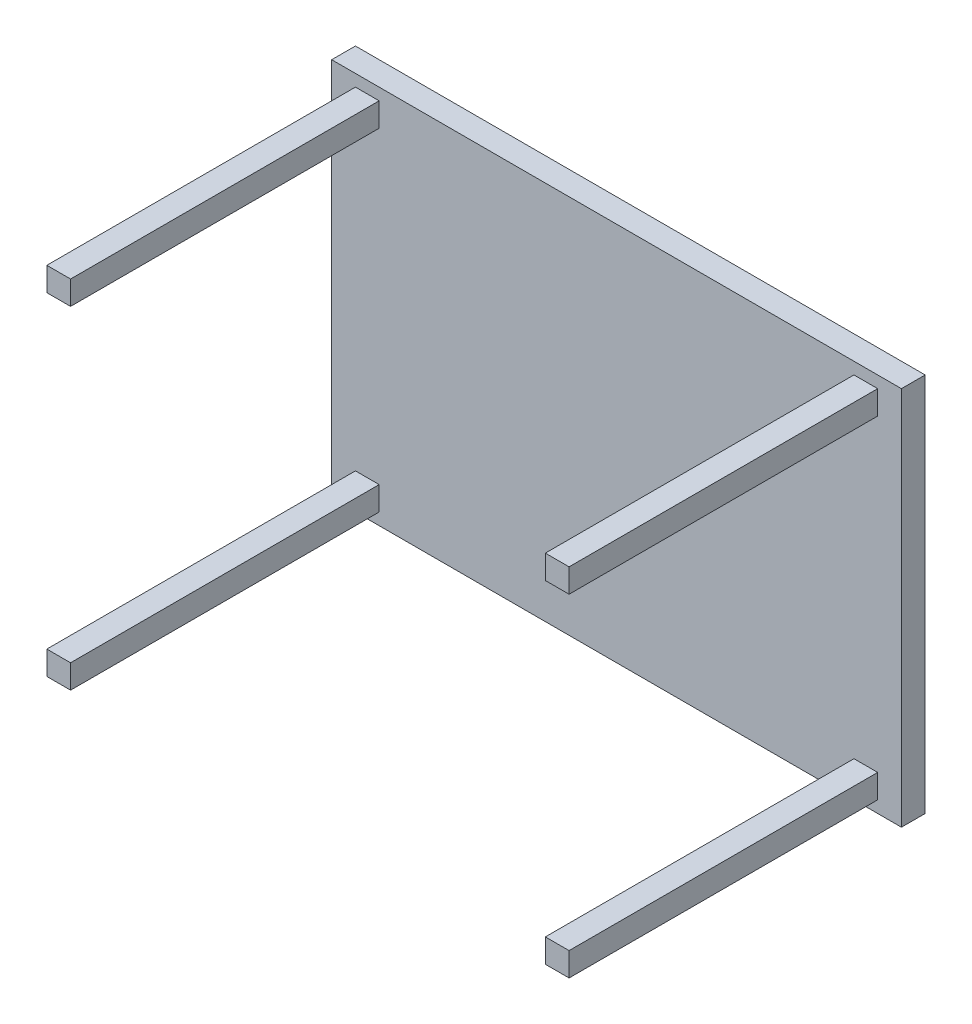
ISO-10303-21;
HEADER;
FILE_DESCRIPTION(('STEP AP214'),'2;1');
FILE_NAME('part.step','',(''),(''),'','','');
FILE_SCHEMA(('AUTOMOTIVE_DESIGN { 1 0 10303 214 1 1 1 1 }'));
ENDSEC;
DATA;
#1=APPLICATION_CONTEXT('core data for automotive mechanical design processes');
#2=APPLICATION_PROTOCOL_DEFINITION('international standard','automotive_design',2000,#1);
#3=PRODUCT_CONTEXT('',#1,'mechanical');
#4=PRODUCT('Part','Part','',(#3));
#5=PRODUCT_RELATED_PRODUCT_CATEGORY('part','',(#4));
#6=PRODUCT_DEFINITION_FORMATION('','',#4);
#7=PRODUCT_DEFINITION_CONTEXT('part definition',#1,'design');
#8=PRODUCT_DEFINITION('design','',#6,#7);
#9=PRODUCT_DEFINITION_SHAPE('','',#8);
#10=(LENGTH_UNIT() NAMED_UNIT(*) SI_UNIT(.MILLI.,.METRE.));
#11=(NAMED_UNIT(*) PLANE_ANGLE_UNIT() SI_UNIT($,.RADIAN.));
#12=(NAMED_UNIT(*) SI_UNIT($,.STERADIAN.) SOLID_ANGLE_UNIT());
#13=UNCERTAINTY_MEASURE_WITH_UNIT(LENGTH_MEASURE(1.E-05),#10,'distance_accuracy_value','');
#14=(GEOMETRIC_REPRESENTATION_CONTEXT(3) GLOBAL_UNCERTAINTY_ASSIGNED_CONTEXT((#13)) GLOBAL_UNIT_ASSIGNED_CONTEXT((#10,
#11,#12)) REPRESENTATION_CONTEXT('',''));
#15=CARTESIAN_POINT('',(0.,0.,0.));
#16=DIRECTION('',(0.,0.,1.));
#17=DIRECTION('',(1.,0.,0.));
#18=AXIS2_PLACEMENT_3D('',#15,#16,#17);
#19=CARTESIAN_POINT('',(0.,0.,50.));
#20=DIRECTION('',(0.,0.,-1.));
#21=DIRECTION('',(-1.,0.,0.));
#22=AXIS2_PLACEMENT_3D('',#19,#20,#21);
#23=PLANE('',#22);
#24=DIRECTION('',(0.,1.,0.));
#25=VECTOR('',#24,1.);
#26=CARTESIAN_POINT('',(-500.,0.,50.));
#27=LINE('',#26,#25);
#28=CARTESIAN_POINT('',(-500.,325.,50.));
#29=VERTEX_POINT('',#28);
#30=CARTESIAN_POINT('',(-500.,375.,50.));
#31=VERTEX_POINT('',#30);
#32=EDGE_CURVE('E240',#29,#31,#27,.T.);
#33=ORIENTED_EDGE('',*,*,#32,.F.);
#34=DIRECTION('',(1.,0.,0.));
#35=VECTOR('',#34,1.);
#36=CARTESIAN_POINT('',(0.,325.,50.));
#37=LINE('',#36,#35);
#38=CARTESIAN_POINT('',(-550.,325.,50.));
#39=VERTEX_POINT('',#38);
#40=EDGE_CURVE('E231',#39,#29,#37,.T.);
#41=ORIENTED_EDGE('',*,*,#40,.F.);
#42=DIRECTION('',(0.,-1.,0.));
#43=VECTOR('',#42,1.);
#44=CARTESIAN_POINT('',(-550.,0.,50.));
#45=LINE('',#44,#43);
#46=CARTESIAN_POINT('',(-550.,375.,50.));
#47=VERTEX_POINT('',#46);
#48=EDGE_CURVE('E234',#47,#39,#45,.T.);
#49=ORIENTED_EDGE('',*,*,#48,.F.);
#50=DIRECTION('',(-1.,0.,0.));
#51=VECTOR('',#50,1.);
#52=CARTESIAN_POINT('',(0.,375.,50.));
#53=LINE('',#52,#51);
#54=EDGE_CURVE('E237',#31,#47,#53,.T.);
#55=ORIENTED_EDGE('',*,*,#54,.F.);
#56=EDGE_LOOP('',(#33,#41,#49,#55));
#57=FACE_BOUND('',#56,.T.);
#58=DIRECTION('',(0.,1.,0.));
#59=VECTOR('',#58,1.);
#60=CARTESIAN_POINT('',(550.,0.,50.));
#61=LINE('',#60,#59);
#62=CARTESIAN_POINT('',(550.,325.,50.));
#63=VERTEX_POINT('',#62);
#64=CARTESIAN_POINT('',(550.,375.,50.));
#65=VERTEX_POINT('',#64);
#66=EDGE_CURVE('E306',#63,#65,#61,.T.);
#67=ORIENTED_EDGE('',*,*,#66,.F.);
#68=DIRECTION('',(1.,0.,0.));
#69=VECTOR('',#68,1.);
#70=CARTESIAN_POINT('',(0.,325.,50.));
#71=LINE('',#70,#69);
#72=CARTESIAN_POINT('',(500.,325.,50.));
#73=VERTEX_POINT('',#72);
#74=EDGE_CURVE('E297',#73,#63,#71,.T.);
#75=ORIENTED_EDGE('',*,*,#74,.F.);
#76=DIRECTION('',(0.,-1.,0.));
#77=VECTOR('',#76,1.);
#78=CARTESIAN_POINT('',(500.,0.,50.));
#79=LINE('',#78,#77);
#80=CARTESIAN_POINT('',(500.,375.,50.));
#81=VERTEX_POINT('',#80);
#82=EDGE_CURVE('E300',#81,#73,#79,.T.);
#83=ORIENTED_EDGE('',*,*,#82,.F.);
#84=DIRECTION('',(-1.,0.,0.));
#85=VECTOR('',#84,1.);
#86=CARTESIAN_POINT('',(0.,375.,50.));
#87=LINE('',#86,#85);
#88=EDGE_CURVE('E303',#65,#81,#87,.T.);
#89=ORIENTED_EDGE('',*,*,#88,.F.);
#90=EDGE_LOOP('',(#67,#75,#83,#89));
#91=FACE_BOUND('',#90,.T.);
#92=DIRECTION('',(0.,1.,0.));
#93=VECTOR('',#92,1.);
#94=CARTESIAN_POINT('',(600.,-400.,50.));
#95=LINE('',#94,#93);
#96=CARTESIAN_POINT('',(600.,-400.,50.));
#97=VERTEX_POINT('',#96);
#98=CARTESIAN_POINT('',(600.,400.,50.));
#99=VERTEX_POINT('',#98);
#100=EDGE_CURVE('E310',#97,#99,#95,.T.);
#101=ORIENTED_EDGE('',*,*,#100,.T.);
#102=DIRECTION('',(-1.,0.,0.));
#103=VECTOR('',#102,1.);
#104=CARTESIAN_POINT('',(-600.,400.,50.));
#105=LINE('',#104,#103);
#106=CARTESIAN_POINT('',(-600.,400.,50.));
#107=VERTEX_POINT('',#106);
#108=EDGE_CURVE('E313',#99,#107,#105,.T.);
#109=ORIENTED_EDGE('',*,*,#108,.T.);
#110=DIRECTION('',(0.,-1.,0.));
#111=VECTOR('',#110,1.);
#112=CARTESIAN_POINT('',(-600.,-400.,50.));
#113=LINE('',#112,#111);
#114=CARTESIAN_POINT('',(-600.,-400.,50.));
#115=VERTEX_POINT('',#114);
#116=EDGE_CURVE('E316',#107,#115,#113,.T.);
#117=ORIENTED_EDGE('',*,*,#116,.T.);
#118=DIRECTION('',(1.,0.,0.));
#119=VECTOR('',#118,1.);
#120=CARTESIAN_POINT('',(-600.,-400.,50.));
#121=LINE('',#120,#119);
#122=EDGE_CURVE('E318',#115,#97,#121,.T.);
#123=ORIENTED_EDGE('',*,*,#122,.T.);
#124=EDGE_LOOP('',(#101,#109,#117,#123));
#125=FACE_BOUND('',#124,.T.);
#126=DIRECTION('',(0.,1.,0.));
#127=VECTOR('',#126,1.);
#128=CARTESIAN_POINT('',(550.,0.,50.));
#129=LINE('',#128,#127);
#130=CARTESIAN_POINT('',(550.,-375.,50.));
#131=VERTEX_POINT('',#130);
#132=CARTESIAN_POINT('',(550.,-325.,50.));
#133=VERTEX_POINT('',#132);
#134=EDGE_CURVE('E273',#131,#133,#129,.T.);
#135=ORIENTED_EDGE('',*,*,#134,.F.);
#136=DIRECTION('',(1.,0.,0.));
#137=VECTOR('',#136,1.);
#138=CARTESIAN_POINT('',(0.,-375.,50.));
#139=LINE('',#138,#137);
#140=CARTESIAN_POINT('',(500.,-375.,50.));
#141=VERTEX_POINT('',#140);
#142=EDGE_CURVE('E264',#141,#131,#139,.T.);
#143=ORIENTED_EDGE('',*,*,#142,.F.);
#144=DIRECTION('',(0.,-1.,0.));
#145=VECTOR('',#144,1.);
#146=CARTESIAN_POINT('',(500.,0.,50.));
#147=LINE('',#146,#145);
#148=CARTESIAN_POINT('',(500.,-325.,50.));
#149=VERTEX_POINT('',#148);
#150=EDGE_CURVE('E267',#149,#141,#147,.T.);
#151=ORIENTED_EDGE('',*,*,#150,.F.);
#152=DIRECTION('',(-1.,0.,0.));
#153=VECTOR('',#152,1.);
#154=CARTESIAN_POINT('',(0.,-325.,50.));
#155=LINE('',#154,#153);
#156=EDGE_CURVE('E270',#133,#149,#155,.T.);
#157=ORIENTED_EDGE('',*,*,#156,.F.);
#158=EDGE_LOOP('',(#135,#143,#151,#157));
#159=FACE_BOUND('',#158,.T.);
#160=DIRECTION('',(0.,1.,0.));
#161=VECTOR('',#160,1.);
#162=CARTESIAN_POINT('',(-500.,0.,50.));
#163=LINE('',#162,#161);
#164=CARTESIAN_POINT('',(-500.,-375.,50.));
#165=VERTEX_POINT('',#164);
#166=CARTESIAN_POINT('',(-500.,-325.,50.));
#167=VERTEX_POINT('',#166);
#168=EDGE_CURVE('E198',#165,#167,#163,.T.);
#169=ORIENTED_EDGE('',*,*,#168,.F.);
#170=DIRECTION('',(1.,0.,0.));
#171=VECTOR('',#170,1.);
#172=CARTESIAN_POINT('',(0.,-375.,50.));
#173=LINE('',#172,#171);
#174=CARTESIAN_POINT('',(-550.,-375.,50.));
#175=VERTEX_POINT('',#174);
#176=EDGE_CURVE('E199',#175,#165,#173,.T.);
#177=ORIENTED_EDGE('',*,*,#176,.F.);
#178=DIRECTION('',(0.,-1.,0.));
#179=VECTOR('',#178,1.);
#180=CARTESIAN_POINT('',(-550.,0.,50.));
#181=LINE('',#180,#179);
#182=CARTESIAN_POINT('',(-550.,-325.,50.));
#183=VERTEX_POINT('',#182);
#184=EDGE_CURVE('E61',#183,#175,#181,.T.);
#185=ORIENTED_EDGE('',*,*,#184,.F.);
#186=DIRECTION('',(-1.,0.,0.));
#187=VECTOR('',#186,1.);
#188=CARTESIAN_POINT('',(0.,-325.,50.));
#189=LINE('',#188,#187);
#190=EDGE_CURVE('E56',#167,#183,#189,.T.);
#191=ORIENTED_EDGE('',*,*,#190,.F.);
#192=EDGE_LOOP('',(#169,#177,#185,#191));
#193=FACE_BOUND('',#192,.T.);
#194=ADVANCED_FACE('F41',(#57,#91,#125,#159,#193),#23,.F.);
#195=CARTESIAN_POINT('',(600.,-400.,50.));
#196=DIRECTION('',(-1.,0.,0.));
#197=DIRECTION('',(0.,0.,1.));
#198=AXIS2_PLACEMENT_3D('',#195,#196,#197);
#199=PLANE('',#198);
#200=DIRECTION('',(0.,1.,0.));
#201=VECTOR('',#200,1.);
#202=CARTESIAN_POINT('',(600.,-400.,0.));
#203=LINE('',#202,#201);
#204=CARTESIAN_POINT('',(600.,-400.,0.));
#205=VERTEX_POINT('',#204);
#206=CARTESIAN_POINT('',(600.,400.,0.));
#207=VERTEX_POINT('',#206);
#208=EDGE_CURVE('E309',#205,#207,#203,.T.);
#209=ORIENTED_EDGE('',*,*,#208,.T.);
#210=DIRECTION('',(0.,0.,-1.));
#211=VECTOR('',#210,1.);
#212=CARTESIAN_POINT('',(600.,400.,50.));
#213=LINE('',#212,#211);
#214=EDGE_CURVE('E11',#99,#207,#213,.T.);
#215=ORIENTED_EDGE('',*,*,#214,.F.);
#216=ORIENTED_EDGE('',*,*,#100,.F.);
#217=DIRECTION('',(0.,0.,-1.));
#218=VECTOR('',#217,1.);
#219=CARTESIAN_POINT('',(600.,-400.,50.));
#220=LINE('',#219,#218);
#221=EDGE_CURVE('E320',#97,#205,#220,.T.);
#222=ORIENTED_EDGE('',*,*,#221,.T.);
#223=EDGE_LOOP('',(#209,#215,#216,#222));
#224=FACE_BOUND('',#223,.T.);
#225=ADVANCED_FACE('F43',(#224),#199,.F.);
#226=CARTESIAN_POINT('',(-600.,400.,50.));
#227=DIRECTION('',(0.,-1.,0.));
#228=DIRECTION('',(0.,0.,-1.));
#229=AXIS2_PLACEMENT_3D('',#226,#227,#228);
#230=PLANE('',#229);
#231=DIRECTION('',(-1.,0.,0.));
#232=VECTOR('',#231,1.);
#233=CARTESIAN_POINT('',(-600.,400.,0.));
#234=LINE('',#233,#232);
#235=CARTESIAN_POINT('',(-600.,400.,0.));
#236=VERTEX_POINT('',#235);
#237=EDGE_CURVE('E323',#207,#236,#234,.T.);
#238=ORIENTED_EDGE('',*,*,#237,.T.);
#239=DIRECTION('',(0.,0.,-1.));
#240=VECTOR('',#239,1.);
#241=CARTESIAN_POINT('',(-600.,400.,50.));
#242=LINE('',#241,#240);
#243=EDGE_CURVE('E49',#107,#236,#242,.T.);
#244=ORIENTED_EDGE('',*,*,#243,.F.);
#245=ORIENTED_EDGE('',*,*,#108,.F.);
#246=ORIENTED_EDGE('',*,*,#214,.T.);
#247=EDGE_LOOP('',(#238,#244,#245,#246));
#248=FACE_BOUND('',#247,.T.);
#249=ADVANCED_FACE('F353',(#248),#230,.F.);
#250=CARTESIAN_POINT('',(-600.,-400.,50.));
#251=DIRECTION('',(1.,0.,0.));
#252=DIRECTION('',(0.,0.,-1.));
#253=AXIS2_PLACEMENT_3D('',#250,#251,#252);
#254=PLANE('',#253);
#255=DIRECTION('',(0.,-1.,0.));
#256=VECTOR('',#255,1.);
#257=CARTESIAN_POINT('',(-600.,-400.,0.));
#258=LINE('',#257,#256);
#259=CARTESIAN_POINT('',(-600.,-400.,0.));
#260=VERTEX_POINT('',#259);
#261=EDGE_CURVE('E325',#236,#260,#258,.T.);
#262=ORIENTED_EDGE('',*,*,#261,.T.);
#263=DIRECTION('',(0.,0.,-1.));
#264=VECTOR('',#263,1.);
#265=CARTESIAN_POINT('',(-600.,-400.,50.));
#266=LINE('',#265,#264);
#267=EDGE_CURVE('E330',#115,#260,#266,.T.);
#268=ORIENTED_EDGE('',*,*,#267,.F.);
#269=ORIENTED_EDGE('',*,*,#116,.F.);
#270=ORIENTED_EDGE('',*,*,#243,.T.);
#271=EDGE_LOOP('',(#262,#268,#269,#270));
#272=FACE_BOUND('',#271,.T.);
#273=ADVANCED_FACE('F337',(#272),#254,.F.);
#274=CARTESIAN_POINT('',(-600.,-400.,50.));
#275=DIRECTION('',(0.,1.,0.));
#276=DIRECTION('',(0.,0.,1.));
#277=AXIS2_PLACEMENT_3D('',#274,#275,#276);
#278=PLANE('',#277);
#279=DIRECTION('',(1.,0.,0.));
#280=VECTOR('',#279,1.);
#281=CARTESIAN_POINT('',(-600.,-400.,0.));
#282=LINE('',#281,#280);
#283=EDGE_CURVE('E314',#260,#205,#282,.T.);
#284=ORIENTED_EDGE('',*,*,#283,.T.);
#285=ORIENTED_EDGE('',*,*,#221,.F.);
#286=ORIENTED_EDGE('',*,*,#122,.F.);
#287=ORIENTED_EDGE('',*,*,#267,.T.);
#288=EDGE_LOOP('',(#284,#285,#286,#287));
#289=FACE_BOUND('',#288,.T.);
#290=ADVANCED_FACE('F346',(#289),#278,.F.);
#291=CARTESIAN_POINT('',(0.,0.,0.));
#292=DIRECTION('',(0.,0.,-1.));
#293=DIRECTION('',(-1.,0.,0.));
#294=AXIS2_PLACEMENT_3D('',#291,#292,#293);
#295=PLANE('',#294);
#296=CARTESIAN_POINT('',(0.,0.,0.));
#297=DIRECTION('',(0.,0.,1.));
#298=DIRECTION('',(1.,0.,0.));
#299=AXIS2_PLACEMENT_3D('',#296,#297,#298);
#300=CIRCLE('',#299,200.);
#301=CARTESIAN_POINT('',(200.,0.,0.));
#302=VERTEX_POINT('',#301);
#303=EDGE_CURVE('E585',#302,#302,#300,.T.);
#304=ORIENTED_EDGE('',*,*,#303,.T.);
#305=EDGE_LOOP('',(#304));
#306=FACE_BOUND('',#305,.T.);
#307=ORIENTED_EDGE('',*,*,#208,.F.);
#308=ORIENTED_EDGE('',*,*,#283,.F.);
#309=ORIENTED_EDGE('',*,*,#261,.F.);
#310=ORIENTED_EDGE('',*,*,#237,.F.);
#311=EDGE_LOOP('',(#307,#308,#309,#310));
#312=FACE_BOUND('',#311,.T.);
#313=ADVANCED_FACE('F343',(#306,#312),#295,.T.);
#314=CARTESIAN_POINT('',(550.,325.,700.));
#315=DIRECTION('',(-1.,0.,0.));
#316=DIRECTION('',(0.,0.,1.));
#317=AXIS2_PLACEMENT_3D('',#314,#315,#316);
#318=PLANE('',#317);
#319=DIRECTION('',(0.,0.,-1.));
#320=VECTOR('',#319,1.);
#321=CARTESIAN_POINT('',(550.,325.,700.));
#322=LINE('',#321,#320);
#323=CARTESIAN_POINT('',(550.,325.,700.));
#324=VERTEX_POINT('',#323);
#325=EDGE_CURVE('E285',#324,#63,#322,.T.);
#326=ORIENTED_EDGE('',*,*,#325,.T.);
#327=ORIENTED_EDGE('',*,*,#66,.T.);
#328=DIRECTION('',(0.,0.,-1.));
#329=VECTOR('',#328,1.);
#330=CARTESIAN_POINT('',(550.,375.,700.));
#331=LINE('',#330,#329);
#332=CARTESIAN_POINT('',(550.,375.,700.));
#333=VERTEX_POINT('',#332);
#334=EDGE_CURVE('E294',#333,#65,#331,.T.);
#335=ORIENTED_EDGE('',*,*,#334,.F.);
#336=DIRECTION('',(0.,1.,0.));
#337=VECTOR('',#336,1.);
#338=CARTESIAN_POINT('',(550.,325.,700.));
#339=LINE('',#338,#337);
#340=EDGE_CURVE('E276',#324,#333,#339,.T.);
#341=ORIENTED_EDGE('',*,*,#340,.F.);
#342=EDGE_LOOP('',(#326,#327,#335,#341));
#343=FACE_BOUND('',#342,.T.);
#344=ADVANCED_FACE('F370',(#343),#318,.F.);
#345=CARTESIAN_POINT('',(500.,375.,700.));
#346=DIRECTION('',(0.,-1.,0.));
#347=DIRECTION('',(0.,0.,-1.));
#348=AXIS2_PLACEMENT_3D('',#345,#346,#347);
#349=PLANE('',#348);
#350=ORIENTED_EDGE('',*,*,#334,.T.);
#351=ORIENTED_EDGE('',*,*,#88,.T.);
#352=DIRECTION('',(0.,0.,-1.));
#353=VECTOR('',#352,1.);
#354=CARTESIAN_POINT('',(500.,375.,700.));
#355=LINE('',#354,#353);
#356=CARTESIAN_POINT('',(500.,375.,700.));
#357=VERTEX_POINT('',#356);
#358=EDGE_CURVE('E291',#357,#81,#355,.T.);
#359=ORIENTED_EDGE('',*,*,#358,.F.);
#360=DIRECTION('',(-1.,0.,0.));
#361=VECTOR('',#360,1.);
#362=CARTESIAN_POINT('',(500.,375.,700.));
#363=LINE('',#362,#361);
#364=EDGE_CURVE('E279',#333,#357,#363,.T.);
#365=ORIENTED_EDGE('',*,*,#364,.F.);
#366=EDGE_LOOP('',(#350,#351,#359,#365));
#367=FACE_BOUND('',#366,.T.);
#368=ADVANCED_FACE('F388',(#367),#349,.F.);
#369=CARTESIAN_POINT('',(500.,325.,700.));
#370=DIRECTION('',(1.,0.,0.));
#371=DIRECTION('',(0.,0.,-1.));
#372=AXIS2_PLACEMENT_3D('',#369,#370,#371);
#373=PLANE('',#372);
#374=ORIENTED_EDGE('',*,*,#358,.T.);
#375=ORIENTED_EDGE('',*,*,#82,.T.);
#376=DIRECTION('',(0.,0.,-1.));
#377=VECTOR('',#376,1.);
#378=CARTESIAN_POINT('',(500.,325.,700.));
#379=LINE('',#378,#377);
#380=CARTESIAN_POINT('',(500.,325.,700.));
#381=VERTEX_POINT('',#380);
#382=EDGE_CURVE('E288',#381,#73,#379,.T.);
#383=ORIENTED_EDGE('',*,*,#382,.F.);
#384=DIRECTION('',(0.,-1.,0.));
#385=VECTOR('',#384,1.);
#386=CARTESIAN_POINT('',(500.,325.,700.));
#387=LINE('',#386,#385);
#388=EDGE_CURVE('E281',#357,#381,#387,.T.);
#389=ORIENTED_EDGE('',*,*,#388,.F.);
#390=EDGE_LOOP('',(#374,#375,#383,#389));
#391=FACE_BOUND('',#390,.T.);
#392=ADVANCED_FACE('F396',(#391),#373,.F.);
#393=CARTESIAN_POINT('',(500.,325.,700.));
#394=DIRECTION('',(0.,1.,0.));
#395=DIRECTION('',(0.,0.,1.));
#396=AXIS2_PLACEMENT_3D('',#393,#394,#395);
#397=PLANE('',#396);
#398=ORIENTED_EDGE('',*,*,#382,.T.);
#399=ORIENTED_EDGE('',*,*,#74,.T.);
#400=ORIENTED_EDGE('',*,*,#325,.F.);
#401=DIRECTION('',(1.,0.,0.));
#402=VECTOR('',#401,1.);
#403=CARTESIAN_POINT('',(500.,325.,700.));
#404=LINE('',#403,#402);
#405=EDGE_CURVE('E283',#381,#324,#404,.T.);
#406=ORIENTED_EDGE('',*,*,#405,.F.);
#407=EDGE_LOOP('',(#398,#399,#400,#406));
#408=FACE_BOUND('',#407,.T.);
#409=ADVANCED_FACE('F404',(#408),#397,.F.);
#410=CARTESIAN_POINT('',(0.,0.,700.));
#411=DIRECTION('',(0.,0.,-1.));
#412=DIRECTION('',(-1.,0.,0.));
#413=AXIS2_PLACEMENT_3D('',#410,#411,#412);
#414=PLANE('',#413);
#415=ORIENTED_EDGE('',*,*,#340,.T.);
#416=ORIENTED_EDGE('',*,*,#364,.T.);
#417=ORIENTED_EDGE('',*,*,#388,.T.);
#418=ORIENTED_EDGE('',*,*,#405,.T.);
#419=EDGE_LOOP('',(#415,#416,#417,#418));
#420=FACE_BOUND('',#419,.T.);
#421=ADVANCED_FACE('F413',(#420),#414,.F.);
#422=CARTESIAN_POINT('',(550.,-375.,700.));
#423=DIRECTION('',(-1.,0.,0.));
#424=DIRECTION('',(0.,0.,1.));
#425=AXIS2_PLACEMENT_3D('',#422,#423,#424);
#426=PLANE('',#425);
#427=DIRECTION('',(0.,0.,-1.));
#428=VECTOR('',#427,1.);
#429=CARTESIAN_POINT('',(550.,-375.,700.));
#430=LINE('',#429,#428);
#431=CARTESIAN_POINT('',(550.,-375.,700.));
#432=VERTEX_POINT('',#431);
#433=EDGE_CURVE('E252',#432,#131,#430,.T.);
#434=ORIENTED_EDGE('',*,*,#433,.T.);
#435=ORIENTED_EDGE('',*,*,#134,.T.);
#436=DIRECTION('',(0.,0.,-1.));
#437=VECTOR('',#436,1.);
#438=CARTESIAN_POINT('',(550.,-325.,700.));
#439=LINE('',#438,#437);
#440=CARTESIAN_POINT('',(550.,-325.,700.));
#441=VERTEX_POINT('',#440);
#442=EDGE_CURVE('E261',#441,#133,#439,.T.);
#443=ORIENTED_EDGE('',*,*,#442,.F.);
#444=DIRECTION('',(0.,1.,0.));
#445=VECTOR('',#444,1.);
#446=CARTESIAN_POINT('',(550.,-375.,700.));
#447=LINE('',#446,#445);
#448=EDGE_CURVE('E243',#432,#441,#447,.T.);
#449=ORIENTED_EDGE('',*,*,#448,.F.);
#450=EDGE_LOOP('',(#434,#435,#443,#449));
#451=FACE_BOUND('',#450,.T.);
#452=ADVANCED_FACE('F422',(#451),#426,.F.);
#453=CARTESIAN_POINT('',(500.,-325.,700.));
#454=DIRECTION('',(0.,-1.,0.));
#455=DIRECTION('',(0.,0.,-1.));
#456=AXIS2_PLACEMENT_3D('',#453,#454,#455);
#457=PLANE('',#456);
#458=ORIENTED_EDGE('',*,*,#442,.T.);
#459=ORIENTED_EDGE('',*,*,#156,.T.);
#460=DIRECTION('',(0.,0.,-1.));
#461=VECTOR('',#460,1.);
#462=CARTESIAN_POINT('',(500.,-325.,700.));
#463=LINE('',#462,#461);
#464=CARTESIAN_POINT('',(500.,-325.,700.));
#465=VERTEX_POINT('',#464);
#466=EDGE_CURVE('E258',#465,#149,#463,.T.);
#467=ORIENTED_EDGE('',*,*,#466,.F.);
#468=DIRECTION('',(-1.,0.,0.));
#469=VECTOR('',#468,1.);
#470=CARTESIAN_POINT('',(500.,-325.,700.));
#471=LINE('',#470,#469);
#472=EDGE_CURVE('E246',#441,#465,#471,.T.);
#473=ORIENTED_EDGE('',*,*,#472,.F.);
#474=EDGE_LOOP('',(#458,#459,#467,#473));
#475=FACE_BOUND('',#474,.T.);
#476=ADVANCED_FACE('F431',(#475),#457,.F.);
#477=CARTESIAN_POINT('',(500.,-375.,700.));
#478=DIRECTION('',(1.,0.,0.));
#479=DIRECTION('',(0.,0.,-1.));
#480=AXIS2_PLACEMENT_3D('',#477,#478,#479);
#481=PLANE('',#480);
#482=ORIENTED_EDGE('',*,*,#466,.T.);
#483=ORIENTED_EDGE('',*,*,#150,.T.);
#484=DIRECTION('',(0.,0.,-1.));
#485=VECTOR('',#484,1.);
#486=CARTESIAN_POINT('',(500.,-375.,700.));
#487=LINE('',#486,#485);
#488=CARTESIAN_POINT('',(500.,-375.,700.));
#489=VERTEX_POINT('',#488);
#490=EDGE_CURVE('E255',#489,#141,#487,.T.);
#491=ORIENTED_EDGE('',*,*,#490,.F.);
#492=DIRECTION('',(0.,-1.,0.));
#493=VECTOR('',#492,1.);
#494=CARTESIAN_POINT('',(500.,-375.,700.));
#495=LINE('',#494,#493);
#496=EDGE_CURVE('E248',#465,#489,#495,.T.);
#497=ORIENTED_EDGE('',*,*,#496,.F.);
#498=EDGE_LOOP('',(#482,#483,#491,#497));
#499=FACE_BOUND('',#498,.T.);
#500=ADVANCED_FACE('F440',(#499),#481,.F.);
#501=CARTESIAN_POINT('',(500.,-375.,700.));
#502=DIRECTION('',(0.,1.,0.));
#503=DIRECTION('',(0.,0.,1.));
#504=AXIS2_PLACEMENT_3D('',#501,#502,#503);
#505=PLANE('',#504);
#506=ORIENTED_EDGE('',*,*,#490,.T.);
#507=ORIENTED_EDGE('',*,*,#142,.T.);
#508=ORIENTED_EDGE('',*,*,#433,.F.);
#509=DIRECTION('',(1.,0.,0.));
#510=VECTOR('',#509,1.);
#511=CARTESIAN_POINT('',(500.,-375.,700.));
#512=LINE('',#511,#510);
#513=EDGE_CURVE('E250',#489,#432,#512,.T.);
#514=ORIENTED_EDGE('',*,*,#513,.F.);
#515=EDGE_LOOP('',(#506,#507,#508,#514));
#516=FACE_BOUND('',#515,.T.);
#517=ADVANCED_FACE('F449',(#516),#505,.F.);
#518=CARTESIAN_POINT('',(0.,0.,700.));
#519=DIRECTION('',(0.,0.,-1.));
#520=DIRECTION('',(-1.,0.,0.));
#521=AXIS2_PLACEMENT_3D('',#518,#519,#520);
#522=PLANE('',#521);
#523=ORIENTED_EDGE('',*,*,#448,.T.);
#524=ORIENTED_EDGE('',*,*,#472,.T.);
#525=ORIENTED_EDGE('',*,*,#496,.T.);
#526=ORIENTED_EDGE('',*,*,#513,.T.);
#527=EDGE_LOOP('',(#523,#524,#525,#526));
#528=FACE_BOUND('',#527,.T.);
#529=ADVANCED_FACE('F458',(#528),#522,.F.);
#530=CARTESIAN_POINT('',(-500.,325.,700.));
#531=DIRECTION('',(-1.,0.,0.));
#532=DIRECTION('',(0.,0.,1.));
#533=AXIS2_PLACEMENT_3D('',#530,#531,#532);
#534=PLANE('',#533);
#535=DIRECTION('',(0.,0.,-1.));
#536=VECTOR('',#535,1.);
#537=CARTESIAN_POINT('',(-500.,325.,700.));
#538=LINE('',#537,#536);
#539=CARTESIAN_POINT('',(-500.,325.,700.));
#540=VERTEX_POINT('',#539);
#541=EDGE_CURVE('E219',#540,#29,#538,.T.);
#542=ORIENTED_EDGE('',*,*,#541,.T.);
#543=ORIENTED_EDGE('',*,*,#32,.T.);
#544=DIRECTION('',(0.,0.,-1.));
#545=VECTOR('',#544,1.);
#546=CARTESIAN_POINT('',(-500.,375.,700.));
#547=LINE('',#546,#545);
#548=CARTESIAN_POINT('',(-500.,375.,700.));
#549=VERTEX_POINT('',#548);
#550=EDGE_CURVE('E228',#549,#31,#547,.T.);
#551=ORIENTED_EDGE('',*,*,#550,.F.);
#552=DIRECTION('',(0.,1.,0.));
#553=VECTOR('',#552,1.);
#554=CARTESIAN_POINT('',(-500.,325.,700.));
#555=LINE('',#554,#553);
#556=EDGE_CURVE('E210',#540,#549,#555,.T.);
#557=ORIENTED_EDGE('',*,*,#556,.F.);
#558=EDGE_LOOP('',(#542,#543,#551,#557));
#559=FACE_BOUND('',#558,.T.);
#560=ADVANCED_FACE('F467',(#559),#534,.F.);
#561=CARTESIAN_POINT('',(-550.,375.,700.));
#562=DIRECTION('',(0.,-1.,0.));
#563=DIRECTION('',(0.,0.,-1.));
#564=AXIS2_PLACEMENT_3D('',#561,#562,#563);
#565=PLANE('',#564);
#566=ORIENTED_EDGE('',*,*,#550,.T.);
#567=ORIENTED_EDGE('',*,*,#54,.T.);
#568=DIRECTION('',(0.,0.,-1.));
#569=VECTOR('',#568,1.);
#570=CARTESIAN_POINT('',(-550.,375.,700.));
#571=LINE('',#570,#569);
#572=CARTESIAN_POINT('',(-550.,375.,700.));
#573=VERTEX_POINT('',#572);
#574=EDGE_CURVE('E225',#573,#47,#571,.T.);
#575=ORIENTED_EDGE('',*,*,#574,.F.);
#576=DIRECTION('',(-1.,0.,0.));
#577=VECTOR('',#576,1.);
#578=CARTESIAN_POINT('',(-550.,375.,700.));
#579=LINE('',#578,#577);
#580=EDGE_CURVE('E213',#549,#573,#579,.T.);
#581=ORIENTED_EDGE('',*,*,#580,.F.);
#582=EDGE_LOOP('',(#566,#567,#575,#581));
#583=FACE_BOUND('',#582,.T.);
#584=ADVANCED_FACE('F476',(#583),#565,.F.);
#585=CARTESIAN_POINT('',(-550.,325.,700.));
#586=DIRECTION('',(1.,0.,0.));
#587=DIRECTION('',(0.,0.,-1.));
#588=AXIS2_PLACEMENT_3D('',#585,#586,#587);
#589=PLANE('',#588);
#590=ORIENTED_EDGE('',*,*,#574,.T.);
#591=ORIENTED_EDGE('',*,*,#48,.T.);
#592=DIRECTION('',(0.,0.,-1.));
#593=VECTOR('',#592,1.);
#594=CARTESIAN_POINT('',(-550.,325.,700.));
#595=LINE('',#594,#593);
#596=CARTESIAN_POINT('',(-550.,325.,700.));
#597=VERTEX_POINT('',#596);
#598=EDGE_CURVE('E222',#597,#39,#595,.T.);
#599=ORIENTED_EDGE('',*,*,#598,.F.);
#600=DIRECTION('',(0.,-1.,0.));
#601=VECTOR('',#600,1.);
#602=CARTESIAN_POINT('',(-550.,325.,700.));
#603=LINE('',#602,#601);
#604=EDGE_CURVE('E215',#573,#597,#603,.T.);
#605=ORIENTED_EDGE('',*,*,#604,.F.);
#606=EDGE_LOOP('',(#590,#591,#599,#605));
#607=FACE_BOUND('',#606,.T.);
#608=ADVANCED_FACE('F485',(#607),#589,.F.);
#609=CARTESIAN_POINT('',(-550.,325.,700.));
#610=DIRECTION('',(0.,1.,0.));
#611=DIRECTION('',(0.,0.,1.));
#612=AXIS2_PLACEMENT_3D('',#609,#610,#611);
#613=PLANE('',#612);
#614=ORIENTED_EDGE('',*,*,#598,.T.);
#615=ORIENTED_EDGE('',*,*,#40,.T.);
#616=ORIENTED_EDGE('',*,*,#541,.F.);
#617=DIRECTION('',(1.,0.,0.));
#618=VECTOR('',#617,1.);
#619=CARTESIAN_POINT('',(-550.,325.,700.));
#620=LINE('',#619,#618);
#621=EDGE_CURVE('E217',#597,#540,#620,.T.);
#622=ORIENTED_EDGE('',*,*,#621,.F.);
#623=EDGE_LOOP('',(#614,#615,#616,#622));
#624=FACE_BOUND('',#623,.T.);
#625=ADVANCED_FACE('F494',(#624),#613,.F.);
#626=CARTESIAN_POINT('',(0.,0.,700.));
#627=DIRECTION('',(0.,0.,-1.));
#628=DIRECTION('',(-1.,0.,0.));
#629=AXIS2_PLACEMENT_3D('',#626,#627,#628);
#630=PLANE('',#629);
#631=ORIENTED_EDGE('',*,*,#556,.T.);
#632=ORIENTED_EDGE('',*,*,#580,.T.);
#633=ORIENTED_EDGE('',*,*,#604,.T.);
#634=ORIENTED_EDGE('',*,*,#621,.T.);
#635=EDGE_LOOP('',(#631,#632,#633,#634));
#636=FACE_BOUND('',#635,.T.);
#637=ADVANCED_FACE('F502',(#636),#630,.F.);
#638=CARTESIAN_POINT('',(-500.,-375.,700.));
#639=DIRECTION('',(-1.,0.,0.));
#640=DIRECTION('',(0.,0.,1.));
#641=AXIS2_PLACEMENT_3D('',#638,#639,#640);
#642=PLANE('',#641);
#643=DIRECTION('',(0.,0.,-1.));
#644=VECTOR('',#643,1.);
#645=CARTESIAN_POINT('',(-500.,-375.,700.));
#646=LINE('',#645,#644);
#647=CARTESIAN_POINT('',(-500.,-375.,700.));
#648=VERTEX_POINT('',#647);
#649=EDGE_CURVE('E592',#648,#165,#646,.T.);
#650=ORIENTED_EDGE('',*,*,#649,.T.);
#651=ORIENTED_EDGE('',*,*,#168,.T.);
#652=DIRECTION('',(0.,0.,-1.));
#653=VECTOR('',#652,1.);
#654=CARTESIAN_POINT('',(-500.,-325.,700.));
#655=LINE('',#654,#653);
#656=CARTESIAN_POINT('',(-500.,-325.,700.));
#657=VERTEX_POINT('',#656);
#658=EDGE_CURVE('E180',#657,#167,#655,.T.);
#659=ORIENTED_EDGE('',*,*,#658,.F.);
#660=DIRECTION('',(0.,1.,0.));
#661=VECTOR('',#660,1.);
#662=CARTESIAN_POINT('',(-500.,-375.,700.));
#663=LINE('',#662,#661);
#664=EDGE_CURVE('E186',#648,#657,#663,.T.);
#665=ORIENTED_EDGE('',*,*,#664,.F.);
#666=EDGE_LOOP('',(#650,#651,#659,#665));
#667=FACE_BOUND('',#666,.T.);
#668=ADVANCED_FACE('F197',(#667),#642,.F.);
#669=CARTESIAN_POINT('',(-550.,-325.,700.));
#670=DIRECTION('',(0.,-1.,0.));
#671=DIRECTION('',(0.,0.,-1.));
#672=AXIS2_PLACEMENT_3D('',#669,#670,#671);
#673=PLANE('',#672);
#674=ORIENTED_EDGE('',*,*,#658,.T.);
#675=ORIENTED_EDGE('',*,*,#190,.T.);
#676=DIRECTION('',(0.,0.,-1.));
#677=VECTOR('',#676,1.);
#678=CARTESIAN_POINT('',(-550.,-325.,700.));
#679=LINE('',#678,#677);
#680=CARTESIAN_POINT('',(-550.,-325.,700.));
#681=VERTEX_POINT('',#680);
#682=EDGE_CURVE('E182',#681,#183,#679,.T.);
#683=ORIENTED_EDGE('',*,*,#682,.F.);
#684=DIRECTION('',(-1.,0.,0.));
#685=VECTOR('',#684,1.);
#686=CARTESIAN_POINT('',(-550.,-325.,700.));
#687=LINE('',#686,#685);
#688=EDGE_CURVE('E176',#657,#681,#687,.T.);
#689=ORIENTED_EDGE('',*,*,#688,.F.);
#690=EDGE_LOOP('',(#674,#675,#683,#689));
#691=FACE_BOUND('',#690,.T.);
#692=ADVANCED_FACE('F178',(#691),#673,.F.);
#693=CARTESIAN_POINT('',(-550.,-375.,700.));
#694=DIRECTION('',(1.,0.,0.));
#695=DIRECTION('',(0.,0.,-1.));
#696=AXIS2_PLACEMENT_3D('',#693,#694,#695);
#697=PLANE('',#696);
#698=ORIENTED_EDGE('',*,*,#682,.T.);
#699=ORIENTED_EDGE('',*,*,#184,.T.);
#700=DIRECTION('',(0.,0.,-1.));
#701=VECTOR('',#700,1.);
#702=CARTESIAN_POINT('',(-550.,-375.,700.));
#703=LINE('',#702,#701);
#704=CARTESIAN_POINT('',(-550.,-375.,700.));
#705=VERTEX_POINT('',#704);
#706=EDGE_CURVE('E203',#705,#175,#703,.T.);
#707=ORIENTED_EDGE('',*,*,#706,.F.);
#708=DIRECTION('',(0.,-1.,0.));
#709=VECTOR('',#708,1.);
#710=CARTESIAN_POINT('',(-550.,-375.,700.));
#711=LINE('',#710,#709);
#712=EDGE_CURVE('E185',#681,#705,#711,.T.);
#713=ORIENTED_EDGE('',*,*,#712,.F.);
#714=EDGE_LOOP('',(#698,#699,#707,#713));
#715=FACE_BOUND('',#714,.T.);
#716=ADVANCED_FACE('F533',(#715),#697,.F.);
#717=CARTESIAN_POINT('',(-550.,-375.,700.));
#718=DIRECTION('',(0.,1.,0.));
#719=DIRECTION('',(0.,0.,1.));
#720=AXIS2_PLACEMENT_3D('',#717,#718,#719);
#721=PLANE('',#720);
#722=ORIENTED_EDGE('',*,*,#706,.T.);
#723=ORIENTED_EDGE('',*,*,#176,.T.);
#724=ORIENTED_EDGE('',*,*,#649,.F.);
#725=DIRECTION('',(1.,0.,0.));
#726=VECTOR('',#725,1.);
#727=CARTESIAN_POINT('',(-550.,-375.,700.));
#728=LINE('',#727,#726);
#729=EDGE_CURVE('E191',#705,#648,#728,.T.);
#730=ORIENTED_EDGE('',*,*,#729,.F.);
#731=EDGE_LOOP('',(#722,#723,#724,#730));
#732=FACE_BOUND('',#731,.T.);
#733=ADVANCED_FACE('F542',(#732),#721,.F.);
#734=CARTESIAN_POINT('',(0.,0.,700.));
#735=DIRECTION('',(0.,0.,-1.));
#736=DIRECTION('',(-1.,0.,0.));
#737=AXIS2_PLACEMENT_3D('',#734,#735,#736);
#738=PLANE('',#737);
#739=ORIENTED_EDGE('',*,*,#664,.T.);
#740=ORIENTED_EDGE('',*,*,#688,.T.);
#741=ORIENTED_EDGE('',*,*,#712,.T.);
#742=ORIENTED_EDGE('',*,*,#729,.T.);
#743=EDGE_LOOP('',(#739,#740,#741,#742));
#744=FACE_BOUND('',#743,.T.);
#745=ADVANCED_FACE('F189',(#744),#738,.F.);
#746=CARTESIAN_POINT('',(0.,0.,20.));
#747=DIRECTION('',(0.,0.,-1.));
#748=DIRECTION('',(-1.,0.,0.));
#749=AXIS2_PLACEMENT_3D('',#746,#747,#748);
#750=CYLINDRICAL_SURFACE('',#749,200.);
#751=CARTESIAN_POINT('',(0.,0.,20.));
#752=DIRECTION('',(0.,0.,1.));
#753=DIRECTION('',(1.,0.,0.));
#754=AXIS2_PLACEMENT_3D('',#751,#752,#753);
#755=CIRCLE('',#754,200.);
#756=CARTESIAN_POINT('',(200.,0.,20.));
#757=VERTEX_POINT('',#756);
#758=EDGE_CURVE('E195',#757,#757,#755,.T.);
#759=ORIENTED_EDGE('',*,*,#758,.T.);
#760=EDGE_LOOP('',(#759));
#761=FACE_BOUND('',#760,.T.);
#762=ORIENTED_EDGE('',*,*,#303,.F.);
#763=EDGE_LOOP('',(#762));
#764=FACE_BOUND('',#763,.T.);
#765=ADVANCED_FACE('F561',(#761,#764),#750,.F.);
#766=CARTESIAN_POINT('',(0.,0.,20.));
#767=DIRECTION('',(0.,0.,1.));
#768=DIRECTION('',(1.,0.,0.));
#769=AXIS2_PLACEMENT_3D('',#766,#767,#768);
#770=PLANE('',#769);
#771=ORIENTED_EDGE('',*,*,#758,.F.);
#772=EDGE_LOOP('',(#771));
#773=FACE_BOUND('',#772,.T.);
#774=ADVANCED_FACE('F570',(#773),#770,.F.);
#775=CLOSED_SHELL('',(#194,#225,#249,#273,#290,#313,#344,#368,#392,#409,#421,#452,#476,#500,
#517,#529,#560,#584,#608,#625,#637,#668,#692,#716,#733,#745,#765,#774));
#776=MANIFOLD_SOLID_BREP('B2',#775);
#777=ADVANCED_BREP_SHAPE_REPRESENTATION('',(#18,#776),#14);
#778=SHAPE_DEFINITION_REPRESENTATION(#9,#777);
ENDSEC;
END-ISO-10303-21;
